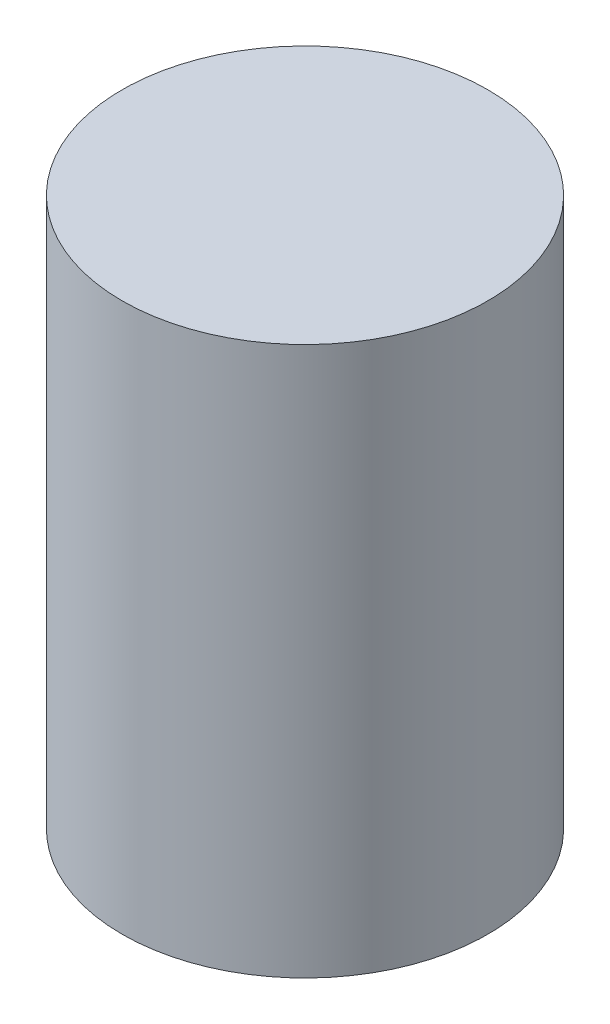
ISO-10303-21;
HEADER;
FILE_DESCRIPTION(('STEP AP214'),'2;1');
FILE_NAME('part.step','',(''),(''),'','','');
FILE_SCHEMA(('AUTOMOTIVE_DESIGN { 1 0 10303 214 1 1 1 1 }'));
ENDSEC;
DATA;
#1=APPLICATION_CONTEXT('core data for automotive mechanical design processes');
#2=APPLICATION_PROTOCOL_DEFINITION('international standard','automotive_design',2000,#1);
#3=PRODUCT_CONTEXT('',#1,'mechanical');
#4=PRODUCT('Part','Part','',(#3));
#5=PRODUCT_RELATED_PRODUCT_CATEGORY('part','',(#4));
#6=PRODUCT_DEFINITION_FORMATION('','',#4);
#7=PRODUCT_DEFINITION_CONTEXT('part definition',#1,'design');
#8=PRODUCT_DEFINITION('design','',#6,#7);
#9=PRODUCT_DEFINITION_SHAPE('','',#8);
#10=(LENGTH_UNIT() NAMED_UNIT(*) SI_UNIT(.MILLI.,.METRE.));
#11=(NAMED_UNIT(*) PLANE_ANGLE_UNIT() SI_UNIT($,.RADIAN.));
#12=(NAMED_UNIT(*) SI_UNIT($,.STERADIAN.) SOLID_ANGLE_UNIT());
#13=UNCERTAINTY_MEASURE_WITH_UNIT(LENGTH_MEASURE(1.E-05),#10,'distance_accuracy_value','');
#14=(GEOMETRIC_REPRESENTATION_CONTEXT(3) GLOBAL_UNCERTAINTY_ASSIGNED_CONTEXT((#13)) GLOBAL_UNIT_ASSIGNED_CONTEXT((#10,
#11,#12)) REPRESENTATION_CONTEXT('',''));
#15=CARTESIAN_POINT('',(0.,0.,0.));
#16=DIRECTION('',(0.,0.,1.));
#17=DIRECTION('',(1.,0.,0.));
#18=AXIS2_PLACEMENT_3D('',#15,#16,#17);
#19=CARTESIAN_POINT('',(-17.4187597417714,180.,-18.5985163776683));
#20=DIRECTION('',(0.,-1.,0.));
#21=DIRECTION('',(0.,0.,-1.));
#22=AXIS2_PLACEMENT_3D('',#19,#20,#21);
#23=CYLINDRICAL_SURFACE('',#22,60.);
#24=CARTESIAN_POINT('',(-17.4187597417714,180.,-18.5985163776683));
#25=DIRECTION('',(0.,1.,0.));
#26=DIRECTION('',(0.,0.,1.));
#27=AXIS2_PLACEMENT_3D('',#24,#25,#26);
#28=CIRCLE('',#27,60.);
#29=CARTESIAN_POINT('',(-17.4187597417714,180.,-78.5985163776683));
#30=VERTEX_POINT('',#29);
#31=EDGE_CURVE('E10',#30,#30,#28,.T.);
#32=CARTESIAN_POINT('',(-17.4187597417714,0.,-18.5985163776683));
#33=DIRECTION('',(0.,1.,0.));
#34=DIRECTION('',(0.,0.,1.));
#35=AXIS2_PLACEMENT_3D('',#32,#33,#34);
#36=CIRCLE('',#35,60.);
#37=CARTESIAN_POINT('',(-17.4187597417714,0.,-78.5985163776683));
#38=VERTEX_POINT('',#37);
#39=EDGE_CURVE('E37',#38,#38,#36,.T.);
#40=CARTESIAN_POINT('',(-17.4187597417714,180.,-78.5985163776683));
#41=CARTESIAN_POINT('',(-17.4187597417714,178.125,-78.5985163776683));
#42=CARTESIAN_POINT('',(-17.4187597417714,176.25,-78.5985163776683));
#43=CARTESIAN_POINT('',(-17.4187597417714,172.5,-78.5985163776683));
#44=CARTESIAN_POINT('',(-17.4187597417714,170.625,-78.5985163776683));
#45=CARTESIAN_POINT('',(-17.4187597417714,166.875,-78.5985163776683));
#46=CARTESIAN_POINT('',(-17.4187597417714,165.,-78.5985163776683));
#47=CARTESIAN_POINT('',(-17.4187597417714,161.25,-78.5985163776683));
#48=CARTESIAN_POINT('',(-17.4187597417714,159.375,-78.5985163776683));
#49=CARTESIAN_POINT('',(-17.4187597417714,155.625,-78.5985163776683));
#50=CARTESIAN_POINT('',(-17.4187597417714,153.75,-78.5985163776683));
#51=CARTESIAN_POINT('',(-17.4187597417714,150.,-78.5985163776683));
#52=CARTESIAN_POINT('',(-17.4187597417714,148.125,-78.5985163776683));
#53=CARTESIAN_POINT('',(-17.4187597417714,144.375,-78.5985163776683));
#54=CARTESIAN_POINT('',(-17.4187597417714,142.5,-78.5985163776683));
#55=CARTESIAN_POINT('',(-17.4187597417714,138.75,-78.5985163776683));
#56=CARTESIAN_POINT('',(-17.4187597417714,136.875,-78.5985163776683));
#57=CARTESIAN_POINT('',(-17.4187597417714,133.125,-78.5985163776683));
#58=CARTESIAN_POINT('',(-17.4187597417714,131.25,-78.5985163776683));
#59=CARTESIAN_POINT('',(-17.4187597417714,127.5,-78.5985163776683));
#60=CARTESIAN_POINT('',(-17.4187597417714,125.625,-78.5985163776683));
#61=CARTESIAN_POINT('',(-17.4187597417714,121.875,-78.5985163776683));
#62=CARTESIAN_POINT('',(-17.4187597417714,120.,-78.5985163776683));
#63=CARTESIAN_POINT('',(-17.4187597417714,116.25,-78.5985163776683));
#64=CARTESIAN_POINT('',(-17.4187597417714,114.375,-78.5985163776683));
#65=CARTESIAN_POINT('',(-17.4187597417714,110.625,-78.5985163776683));
#66=CARTESIAN_POINT('',(-17.4187597417714,108.75,-78.5985163776683));
#67=CARTESIAN_POINT('',(-17.4187597417714,105.,-78.5985163776683));
#68=CARTESIAN_POINT('',(-17.4187597417714,103.125,-78.5985163776683));
#69=CARTESIAN_POINT('',(-17.4187597417714,99.375,-78.5985163776683));
#70=CARTESIAN_POINT('',(-17.4187597417714,97.5,-78.5985163776683));
#71=CARTESIAN_POINT('',(-17.4187597417714,93.75,-78.5985163776683));
#72=CARTESIAN_POINT('',(-17.4187597417714,91.875,-78.5985163776683));
#73=CARTESIAN_POINT('',(-17.4187597417714,88.125,-78.5985163776683));
#74=CARTESIAN_POINT('',(-17.4187597417714,86.25,-78.5985163776683));
#75=CARTESIAN_POINT('',(-17.4187597417714,82.5,-78.5985163776683));
#76=CARTESIAN_POINT('',(-17.4187597417714,80.625,-78.5985163776683));
#77=CARTESIAN_POINT('',(-17.4187597417714,76.875,-78.5985163776683));
#78=CARTESIAN_POINT('',(-17.4187597417714,75.,-78.5985163776683));
#79=CARTESIAN_POINT('',(-17.4187597417714,71.25,-78.5985163776683));
#80=CARTESIAN_POINT('',(-17.4187597417714,69.375,-78.5985163776683));
#81=CARTESIAN_POINT('',(-17.4187597417714,65.625,-78.5985163776683));
#82=CARTESIAN_POINT('',(-17.4187597417714,63.75,-78.5985163776683));
#83=CARTESIAN_POINT('',(-17.4187597417714,60.,-78.5985163776683));
#84=CARTESIAN_POINT('',(-17.4187597417714,58.125,-78.5985163776683));
#85=CARTESIAN_POINT('',(-17.4187597417714,54.375,-78.5985163776683));
#86=CARTESIAN_POINT('',(-17.4187597417714,52.5,-78.5985163776683));
#87=CARTESIAN_POINT('',(-17.4187597417714,48.75,-78.5985163776683));
#88=CARTESIAN_POINT('',(-17.4187597417714,46.875,-78.5985163776683));
#89=CARTESIAN_POINT('',(-17.4187597417714,43.125,-78.5985163776683));
#90=CARTESIAN_POINT('',(-17.4187597417714,41.25,-78.5985163776683));
#91=CARTESIAN_POINT('',(-17.4187597417714,37.5,-78.5985163776683));
#92=CARTESIAN_POINT('',(-17.4187597417714,35.625,-78.5985163776683));
#93=CARTESIAN_POINT('',(-17.4187597417714,31.875,-78.5985163776683));
#94=CARTESIAN_POINT('',(-17.4187597417714,30.,-78.5985163776683));
#95=CARTESIAN_POINT('',(-17.4187597417714,26.25,-78.5985163776683));
#96=CARTESIAN_POINT('',(-17.4187597417714,24.375,-78.5985163776683));
#97=CARTESIAN_POINT('',(-17.4187597417714,20.625,-78.5985163776683));
#98=CARTESIAN_POINT('',(-17.4187597417714,18.75,-78.5985163776683));
#99=CARTESIAN_POINT('',(-17.4187597417714,15.,-78.5985163776683));
#100=CARTESIAN_POINT('',(-17.4187597417714,13.125,-78.5985163776683));
#101=CARTESIAN_POINT('',(-17.4187597417714,9.37499999999998,-78.5985163776683));
#102=CARTESIAN_POINT('',(-17.4187597417714,7.49999999999997,-78.5985163776683));
#103=CARTESIAN_POINT('',(-17.4187597417714,3.74999999999997,-78.5985163776683));
#104=CARTESIAN_POINT('',(-17.4187597417714,1.87499999999997,-78.5985163776683));
#105=CARTESIAN_POINT('',(-17.4187597417714,0.,-78.5985163776683));
#106=B_SPLINE_CURVE_WITH_KNOTS('',3,(#40,#41,#42,#43,#44,#45,#46,#47,#48,#49,#50,#51,#52,#53,
#54,#55,#56,#57,#58,#59,#60,#61,#62,#63,#64,#65,#66,#67,#68,#69,#70,#71,#72,#73,#74,#75,#76,#77,
#78,#79,#80,#81,#82,#83,#84,#85,#86,#87,#88,#89,#90,#91,#92,#93,#94,#95,#96,#97,#98,#99,#100,
#101,#102,#103,#104,#105),.UNSPECIFIED.,.F.,.F.,(4,2,2,2,2,2,2,2,2,2,2,2,2,2,2,2,2,2,2,2,2,2,2,
2,2,2,2,2,2,2,2,2,4),(0.,5.62499999999999,11.25,16.875,22.5,28.125,33.75,39.375,45.,50.625,
56.25,61.875,67.5,73.125,78.75,84.375,90.,95.625,101.25,106.875,112.5,118.125,123.75,129.375,
135.,140.625,146.25,151.875,157.5,163.125,168.75,174.375,180.),.UNSPECIFIED.);
#107=EDGE_CURVE('BSEAM40',#30,#38,#106,.T.);
#108=ORIENTED_EDGE('',*,*,#31,.F.);
#109=ORIENTED_EDGE('',*,*,#39,.T.);
#110=ORIENTED_EDGE('',*,*,#107,.T.);
#111=ORIENTED_EDGE('',*,*,#107,.F.);
#112=EDGE_LOOP('',(#108,#110,#109,#111));
#113=FACE_BOUND('',#112,.T.);
#114=ADVANCED_FACE('F40',(#113),#23,.T.);
#115=CARTESIAN_POINT('',(-17.4187597417714,180.,-18.5985163776683));
#116=DIRECTION('',(0.,1.,0.));
#117=DIRECTION('',(0.,0.,1.));
#118=AXIS2_PLACEMENT_3D('',#115,#116,#117);
#119=PLANE('',#118);
#120=ORIENTED_EDGE('',*,*,#31,.T.);
#121=EDGE_LOOP('',(#120));
#122=FACE_BOUND('',#121,.T.);
#123=ADVANCED_FACE('F55',(#122),#119,.T.);
#124=CARTESIAN_POINT('',(-17.4187597417714,0.,-18.5985163776683));
#125=DIRECTION('',(0.,1.,0.));
#126=DIRECTION('',(0.,0.,1.));
#127=AXIS2_PLACEMENT_3D('',#124,#125,#126);
#128=PLANE('',#127);
#129=ORIENTED_EDGE('',*,*,#39,.F.);
#130=EDGE_LOOP('',(#129));
#131=FACE_BOUND('',#130,.T.);
#132=ADVANCED_FACE('F49',(#131),#128,.F.);
#133=CLOSED_SHELL('',(#114,#123,#132));
#134=MANIFOLD_SOLID_BREP('B2',#133);
#135=ADVANCED_BREP_SHAPE_REPRESENTATION('',(#18,#134),#14);
#136=SHAPE_DEFINITION_REPRESENTATION(#9,#135);
ENDSEC;
END-ISO-10303-21;
